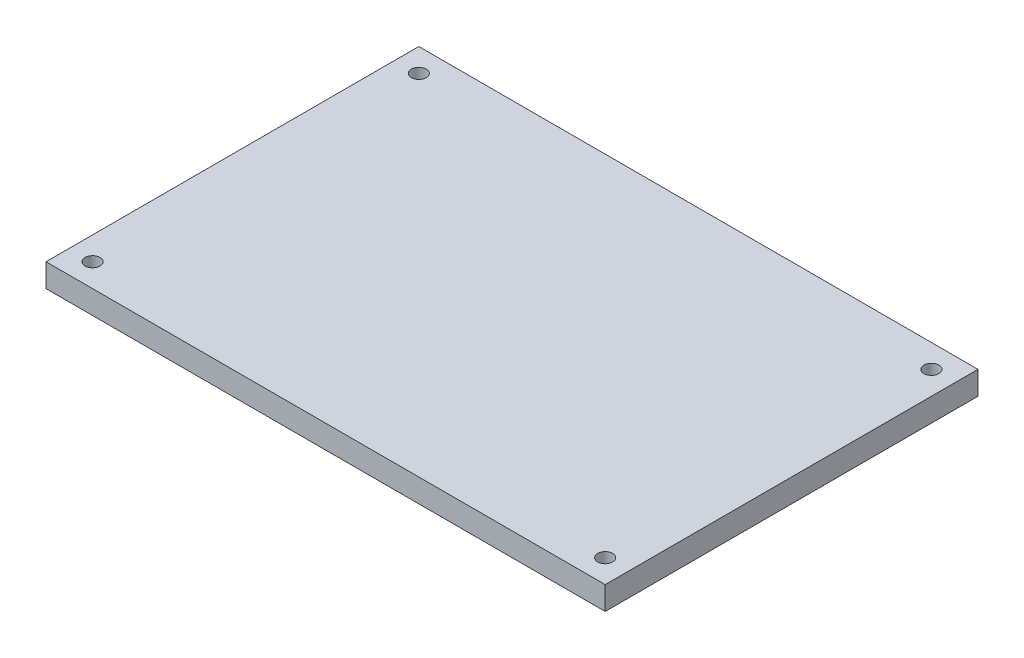
ISO-10303-21;
HEADER;
FILE_DESCRIPTION(('STEP AP214'),'2;1');
FILE_NAME('part.step','',(''),(''),'','','');
FILE_SCHEMA(('AUTOMOTIVE_DESIGN { 1 0 10303 214 1 1 1 1 }'));
ENDSEC;
DATA;
#1=APPLICATION_CONTEXT('core data for automotive mechanical design processes');
#2=APPLICATION_PROTOCOL_DEFINITION('international standard','automotive_design',2000,#1);
#3=PRODUCT_CONTEXT('',#1,'mechanical');
#4=PRODUCT('Part','Part','',(#3));
#5=PRODUCT_RELATED_PRODUCT_CATEGORY('part','',(#4));
#6=PRODUCT_DEFINITION_FORMATION('','',#4);
#7=PRODUCT_DEFINITION_CONTEXT('part definition',#1,'design');
#8=PRODUCT_DEFINITION('design','',#6,#7);
#9=PRODUCT_DEFINITION_SHAPE('','',#8);
#10=(LENGTH_UNIT() NAMED_UNIT(*) SI_UNIT(.MILLI.,.METRE.));
#11=(NAMED_UNIT(*) PLANE_ANGLE_UNIT() SI_UNIT($,.RADIAN.));
#12=(NAMED_UNIT(*) SI_UNIT($,.STERADIAN.) SOLID_ANGLE_UNIT());
#13=UNCERTAINTY_MEASURE_WITH_UNIT(LENGTH_MEASURE(1.E-05),#10,'distance_accuracy_value','');
#14=(GEOMETRIC_REPRESENTATION_CONTEXT(3) GLOBAL_UNCERTAINTY_ASSIGNED_CONTEXT((#13)) GLOBAL_UNIT_ASSIGNED_CONTEXT((#10,
#11,#12)) REPRESENTATION_CONTEXT('',''));
#15=CARTESIAN_POINT('',(0.,0.,0.));
#16=DIRECTION('',(0.,0.,1.));
#17=DIRECTION('',(1.,0.,0.));
#18=AXIS2_PLACEMENT_3D('',#15,#16,#17);
#19=CARTESIAN_POINT('',(0.,5.,0.));
#20=DIRECTION('',(1.,0.,0.));
#21=DIRECTION('',(0.,0.,-1.));
#22=AXIS2_PLACEMENT_3D('',#19,#20,#21);
#23=PLANE('',#22);
#24=DIRECTION('',(0.,0.,1.));
#25=VECTOR('',#24,1.);
#26=CARTESIAN_POINT('',(0.,0.,0.));
#27=LINE('',#26,#25);
#28=CARTESIAN_POINT('',(0.,0.,-80.));
#29=VERTEX_POINT('',#28);
#30=CARTESIAN_POINT('',(0.,0.,0.));
#31=VERTEX_POINT('',#30);
#32=EDGE_CURVE('E96',#29,#31,#27,.T.);
#33=ORIENTED_EDGE('',*,*,#32,.T.);
#34=DIRECTION('',(0.,-1.,0.));
#35=VECTOR('',#34,1.);
#36=CARTESIAN_POINT('',(0.,5.,0.));
#37=LINE('',#36,#35);
#38=CARTESIAN_POINT('',(0.,5.,0.));
#39=VERTEX_POINT('',#38);
#40=EDGE_CURVE('E11',#39,#31,#37,.T.);
#41=ORIENTED_EDGE('',*,*,#40,.F.);
#42=DIRECTION('',(0.,0.,1.));
#43=VECTOR('',#42,1.);
#44=CARTESIAN_POINT('',(0.,5.,0.));
#45=LINE('',#44,#43);
#46=CARTESIAN_POINT('',(0.,5.,-80.));
#47=VERTEX_POINT('',#46);
#48=EDGE_CURVE('E84',#47,#39,#45,.T.);
#49=ORIENTED_EDGE('',*,*,#48,.F.);
#50=DIRECTION('',(0.,-1.,0.));
#51=VECTOR('',#50,1.);
#52=CARTESIAN_POINT('',(0.,5.,-80.));
#53=LINE('',#52,#51);
#54=EDGE_CURVE('E92',#47,#29,#53,.T.);
#55=ORIENTED_EDGE('',*,*,#54,.T.);
#56=EDGE_LOOP('',(#33,#41,#49,#55));
#57=FACE_BOUND('',#56,.T.);
#58=ADVANCED_FACE('F33',(#57),#23,.F.);
#59=CARTESIAN_POINT('',(0.,5.,0.));
#60=DIRECTION('',(0.,0.,-1.));
#61=DIRECTION('',(-1.,0.,0.));
#62=AXIS2_PLACEMENT_3D('',#59,#60,#61);
#63=PLANE('',#62);
#64=DIRECTION('',(1.,0.,0.));
#65=VECTOR('',#64,1.);
#66=CARTESIAN_POINT('',(0.,0.,0.));
#67=LINE('',#66,#65);
#68=CARTESIAN_POINT('',(120.,0.,0.));
#69=VERTEX_POINT('',#68);
#70=EDGE_CURVE('E88',#31,#69,#67,.T.);
#71=ORIENTED_EDGE('',*,*,#70,.T.);
#72=DIRECTION('',(0.,-1.,0.));
#73=VECTOR('',#72,1.);
#74=CARTESIAN_POINT('',(120.,5.,0.));
#75=LINE('',#74,#73);
#76=CARTESIAN_POINT('',(120.,5.,0.));
#77=VERTEX_POINT('',#76);
#78=EDGE_CURVE('E41',#77,#69,#75,.T.);
#79=ORIENTED_EDGE('',*,*,#78,.F.);
#80=DIRECTION('',(1.,0.,0.));
#81=VECTOR('',#80,1.);
#82=CARTESIAN_POINT('',(0.,5.,0.));
#83=LINE('',#82,#81);
#84=EDGE_CURVE('E79',#39,#77,#83,.T.);
#85=ORIENTED_EDGE('',*,*,#84,.F.);
#86=ORIENTED_EDGE('',*,*,#40,.T.);
#87=EDGE_LOOP('',(#71,#79,#85,#86));
#88=FACE_BOUND('',#87,.T.);
#89=ADVANCED_FACE('F87',(#88),#63,.F.);
#90=CARTESIAN_POINT('',(120.,5.,0.));
#91=DIRECTION('',(-1.,0.,0.));
#92=DIRECTION('',(0.,0.,1.));
#93=AXIS2_PLACEMENT_3D('',#90,#91,#92);
#94=PLANE('',#93);
#95=DIRECTION('',(0.,0.,-1.));
#96=VECTOR('',#95,1.);
#97=CARTESIAN_POINT('',(120.,0.,0.));
#98=LINE('',#97,#96);
#99=CARTESIAN_POINT('',(120.,0.,-80.));
#100=VERTEX_POINT('',#99);
#101=EDGE_CURVE('E66',#69,#100,#98,.T.);
#102=ORIENTED_EDGE('',*,*,#101,.T.);
#103=DIRECTION('',(0.,-1.,0.));
#104=VECTOR('',#103,1.);
#105=CARTESIAN_POINT('',(120.,5.,-80.));
#106=LINE('',#105,#104);
#107=CARTESIAN_POINT('',(120.,5.,-80.));
#108=VERTEX_POINT('',#107);
#109=EDGE_CURVE('E89',#108,#100,#106,.T.);
#110=ORIENTED_EDGE('',*,*,#109,.F.);
#111=DIRECTION('',(0.,0.,-1.));
#112=VECTOR('',#111,1.);
#113=CARTESIAN_POINT('',(120.,5.,0.));
#114=LINE('',#113,#112);
#115=EDGE_CURVE('E82',#77,#108,#114,.T.);
#116=ORIENTED_EDGE('',*,*,#115,.F.);
#117=ORIENTED_EDGE('',*,*,#78,.T.);
#118=EDGE_LOOP('',(#102,#110,#116,#117));
#119=FACE_BOUND('',#118,.T.);
#120=ADVANCED_FACE('F90',(#119),#94,.F.);
#121=CARTESIAN_POINT('',(0.,5.,-80.));
#122=DIRECTION('',(0.,0.,1.));
#123=DIRECTION('',(1.,0.,0.));
#124=AXIS2_PLACEMENT_3D('',#121,#122,#123);
#125=PLANE('',#124);
#126=DIRECTION('',(-1.,0.,0.));
#127=VECTOR('',#126,1.);
#128=CARTESIAN_POINT('',(0.,0.,-80.));
#129=LINE('',#128,#127);
#130=EDGE_CURVE('E72',#100,#29,#129,.T.);
#131=ORIENTED_EDGE('',*,*,#130,.T.);
#132=ORIENTED_EDGE('',*,*,#54,.F.);
#133=DIRECTION('',(-1.,0.,0.));
#134=VECTOR('',#133,1.);
#135=CARTESIAN_POINT('',(0.,5.,-80.));
#136=LINE('',#135,#134);
#137=EDGE_CURVE('E49',#108,#47,#136,.T.);
#138=ORIENTED_EDGE('',*,*,#137,.F.);
#139=ORIENTED_EDGE('',*,*,#109,.T.);
#140=EDGE_LOOP('',(#131,#132,#138,#139));
#141=FACE_BOUND('',#140,.T.);
#142=ADVANCED_FACE('F104',(#141),#125,.F.);
#143=CARTESIAN_POINT('',(0.,5.,0.));
#144=DIRECTION('',(0.,-1.,0.));
#145=DIRECTION('',(0.,0.,-1.));
#146=AXIS2_PLACEMENT_3D('',#143,#144,#145);
#147=PLANE('',#146);
#148=CARTESIAN_POINT('',(5.,5.,-5.00000000000003));
#149=DIRECTION('',(0.,-1.,0.));
#150=DIRECTION('',(0.,0.,-1.));
#151=AXIS2_PLACEMENT_3D('',#148,#149,#150);
#152=CIRCLE('',#151,1.6);
#153=CARTESIAN_POINT('',(5.,5.,-6.60000000000004));
#154=VERTEX_POINT('',#153);
#155=EDGE_CURVE('E99',#154,#154,#152,.F.);
#156=ORIENTED_EDGE('',*,*,#155,.F.);
#157=EDGE_LOOP('',(#156));
#158=FACE_BOUND('',#157,.T.);
#159=CARTESIAN_POINT('',(115.,5.,-4.99999999999995));
#160=DIRECTION('',(0.,-1.,0.));
#161=DIRECTION('',(0.,0.,-1.));
#162=AXIS2_PLACEMENT_3D('',#159,#160,#161);
#163=CIRCLE('',#162,1.60000000000001);
#164=CARTESIAN_POINT('',(115.,5.,-6.59999999999996));
#165=VERTEX_POINT('',#164);
#166=EDGE_CURVE('E112',#165,#165,#163,.F.);
#167=ORIENTED_EDGE('',*,*,#166,.F.);
#168=EDGE_LOOP('',(#167));
#169=FACE_BOUND('',#168,.T.);
#170=CARTESIAN_POINT('',(115.,5.,-75.0000000000001));
#171=DIRECTION('',(0.,-1.,0.));
#172=DIRECTION('',(0.,0.,-1.));
#173=AXIS2_PLACEMENT_3D('',#170,#171,#172);
#174=CIRCLE('',#173,1.60000000000001);
#175=CARTESIAN_POINT('',(115.,5.,-76.6000000000001));
#176=VERTEX_POINT('',#175);
#177=EDGE_CURVE('E115',#176,#176,#174,.F.);
#178=ORIENTED_EDGE('',*,*,#177,.F.);
#179=EDGE_LOOP('',(#178));
#180=FACE_BOUND('',#179,.T.);
#181=CARTESIAN_POINT('',(5.,5.,-75.));
#182=DIRECTION('',(0.,-1.,0.));
#183=DIRECTION('',(0.,0.,-1.));
#184=AXIS2_PLACEMENT_3D('',#181,#182,#183);
#185=CIRCLE('',#184,1.6);
#186=CARTESIAN_POINT('',(5.,5.,-76.6));
#187=VERTEX_POINT('',#186);
#188=EDGE_CURVE('E118',#187,#187,#185,.F.);
#189=ORIENTED_EDGE('',*,*,#188,.F.);
#190=EDGE_LOOP('',(#189));
#191=FACE_BOUND('',#190,.T.);
#192=ORIENTED_EDGE('',*,*,#48,.T.);
#193=ORIENTED_EDGE('',*,*,#84,.T.);
#194=ORIENTED_EDGE('',*,*,#115,.T.);
#195=ORIENTED_EDGE('',*,*,#137,.T.);
#196=EDGE_LOOP('',(#192,#193,#194,#195));
#197=FACE_BOUND('',#196,.T.);
#198=ADVANCED_FACE('F80',(#158,#169,#180,#191,#197),#147,.F.);
#199=CARTESIAN_POINT('',(0.,0.,0.));
#200=DIRECTION('',(0.,-1.,0.));
#201=DIRECTION('',(0.,0.,-1.));
#202=AXIS2_PLACEMENT_3D('',#199,#200,#201);
#203=PLANE('',#202);
#204=CARTESIAN_POINT('',(5.,0.,-5.00000000000003));
#205=DIRECTION('',(0.,1.,0.));
#206=DIRECTION('',(0.,0.,-1.));
#207=AXIS2_PLACEMENT_3D('',#204,#205,#206);
#208=CIRCLE('',#207,1.6);
#209=CARTESIAN_POINT('',(5.,0.,-6.60000000000004));
#210=VERTEX_POINT('',#209);
#211=EDGE_CURVE('E125',#210,#210,#208,.T.);
#212=ORIENTED_EDGE('',*,*,#211,.T.);
#213=EDGE_LOOP('',(#212));
#214=FACE_BOUND('',#213,.T.);
#215=CARTESIAN_POINT('',(115.,0.,-4.99999999999995));
#216=DIRECTION('',(0.,1.,0.));
#217=DIRECTION('',(0.,0.,1.));
#218=AXIS2_PLACEMENT_3D('',#215,#216,#217);
#219=CIRCLE('',#218,1.60000000000001);
#220=CARTESIAN_POINT('',(115.,0.,-3.39999999999994));
#221=VERTEX_POINT('',#220);
#222=EDGE_CURVE('E128',#221,#221,#219,.T.);
#223=ORIENTED_EDGE('',*,*,#222,.T.);
#224=EDGE_LOOP('',(#223));
#225=FACE_BOUND('',#224,.T.);
#226=CARTESIAN_POINT('',(115.,0.,-75.0000000000001));
#227=DIRECTION('',(0.,1.,0.));
#228=DIRECTION('',(0.,0.,-1.));
#229=AXIS2_PLACEMENT_3D('',#226,#227,#228);
#230=CIRCLE('',#229,1.60000000000001);
#231=CARTESIAN_POINT('',(115.,0.,-76.6000000000001));
#232=VERTEX_POINT('',#231);
#233=EDGE_CURVE('E124',#232,#232,#230,.T.);
#234=ORIENTED_EDGE('',*,*,#233,.T.);
#235=EDGE_LOOP('',(#234));
#236=FACE_BOUND('',#235,.T.);
#237=CARTESIAN_POINT('',(5.,0.,-75.));
#238=DIRECTION('',(0.,1.,0.));
#239=DIRECTION('',(0.,0.,1.));
#240=AXIS2_PLACEMENT_3D('',#237,#238,#239);
#241=CIRCLE('',#240,1.6);
#242=CARTESIAN_POINT('',(5.,0.,-73.4));
#243=VERTEX_POINT('',#242);
#244=EDGE_CURVE('E121',#243,#243,#241,.T.);
#245=ORIENTED_EDGE('',*,*,#244,.T.);
#246=EDGE_LOOP('',(#245));
#247=FACE_BOUND('',#246,.T.);
#248=ORIENTED_EDGE('',*,*,#32,.F.);
#249=ORIENTED_EDGE('',*,*,#130,.F.);
#250=ORIENTED_EDGE('',*,*,#101,.F.);
#251=ORIENTED_EDGE('',*,*,#70,.F.);
#252=EDGE_LOOP('',(#248,#249,#250,#251));
#253=FACE_BOUND('',#252,.T.);
#254=ADVANCED_FACE('F107',(#214,#225,#236,#247,#253),#203,.T.);
#255=CARTESIAN_POINT('',(5.,10.,-75.));
#256=DIRECTION('',(0.,-1.,0.));
#257=DIRECTION('',(0.,0.,-1.));
#258=AXIS2_PLACEMENT_3D('',#255,#256,#257);
#259=CYLINDRICAL_SURFACE('',#258,1.6);
#260=ORIENTED_EDGE('',*,*,#244,.F.);
#261=EDGE_LOOP('',(#260));
#262=FACE_BOUND('',#261,.T.);
#263=ORIENTED_EDGE('',*,*,#188,.T.);
#264=EDGE_LOOP('',(#263));
#265=FACE_BOUND('',#264,.T.);
#266=ADVANCED_FACE('F140',(#262,#265),#259,.F.);
#267=CARTESIAN_POINT('',(115.,10.,-75.0000000000001));
#268=DIRECTION('',(0.,-1.,0.));
#269=DIRECTION('',(0.,0.,-1.));
#270=AXIS2_PLACEMENT_3D('',#267,#268,#269);
#271=CYLINDRICAL_SURFACE('',#270,1.60000000000001);
#272=ORIENTED_EDGE('',*,*,#233,.F.);
#273=EDGE_LOOP('',(#272));
#274=FACE_BOUND('',#273,.T.);
#275=ORIENTED_EDGE('',*,*,#177,.T.);
#276=EDGE_LOOP('',(#275));
#277=FACE_BOUND('',#276,.T.);
#278=ADVANCED_FACE('F136',(#274,#277),#271,.F.);
#279=CARTESIAN_POINT('',(115.,10.,-4.99999999999995));
#280=DIRECTION('',(0.,-1.,0.));
#281=DIRECTION('',(0.,0.,-1.));
#282=AXIS2_PLACEMENT_3D('',#279,#280,#281);
#283=CYLINDRICAL_SURFACE('',#282,1.60000000000001);
#284=ORIENTED_EDGE('',*,*,#222,.F.);
#285=EDGE_LOOP('',(#284));
#286=FACE_BOUND('',#285,.T.);
#287=ORIENTED_EDGE('',*,*,#166,.T.);
#288=EDGE_LOOP('',(#287));
#289=FACE_BOUND('',#288,.T.);
#290=ADVANCED_FACE('F139',(#286,#289),#283,.F.);
#291=CARTESIAN_POINT('',(5.,10.,-5.00000000000003));
#292=DIRECTION('',(0.,-1.,0.));
#293=DIRECTION('',(0.,0.,-1.));
#294=AXIS2_PLACEMENT_3D('',#291,#292,#293);
#295=CYLINDRICAL_SURFACE('',#294,1.6);
#296=ORIENTED_EDGE('',*,*,#211,.F.);
#297=EDGE_LOOP('',(#296));
#298=FACE_BOUND('',#297,.T.);
#299=ORIENTED_EDGE('',*,*,#155,.T.);
#300=EDGE_LOOP('',(#299));
#301=FACE_BOUND('',#300,.T.);
#302=ADVANCED_FACE('F203',(#298,#301),#295,.F.);
#303=CLOSED_SHELL('',(#58,#89,#120,#142,#198,#254,#266,#278,#290,#302));
#304=MANIFOLD_SOLID_BREP('B2',#303);
#305=ADVANCED_BREP_SHAPE_REPRESENTATION('',(#18,#304),#14);
#306=SHAPE_DEFINITION_REPRESENTATION(#9,#305);
ENDSEC;
END-ISO-10303-21;
